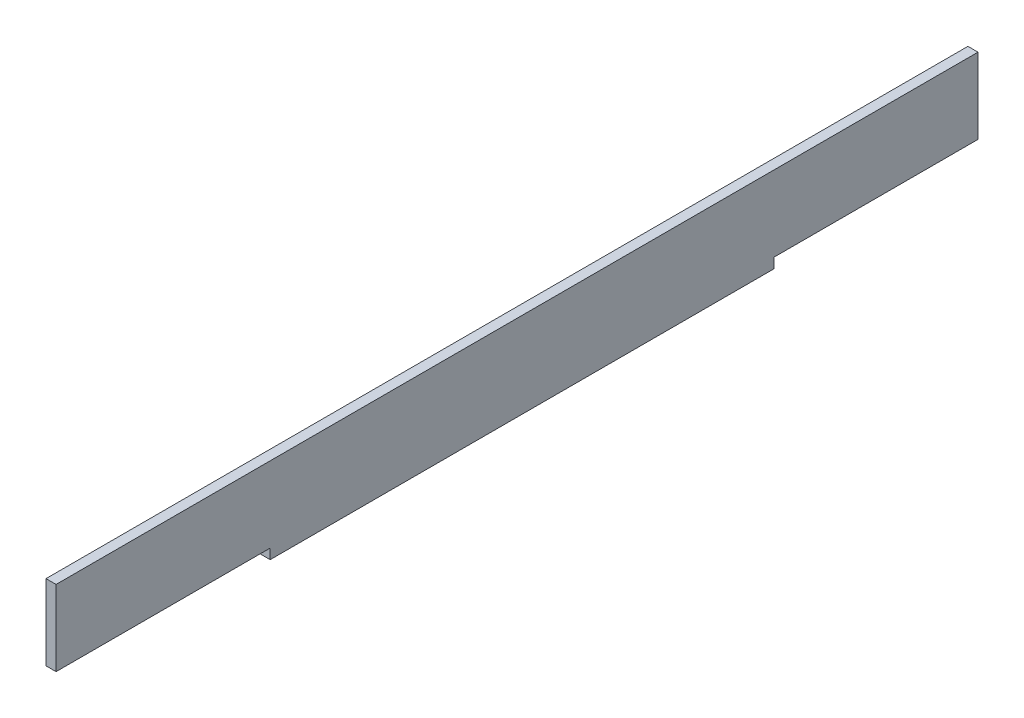
ISO-10303-21;
HEADER;
FILE_DESCRIPTION(('STEP AP214'),'2;1');
FILE_NAME('part.step','',(''),(''),'','','');
FILE_SCHEMA(('AUTOMOTIVE_DESIGN { 1 0 10303 214 1 1 1 1 }'));
ENDSEC;
DATA;
#1=APPLICATION_CONTEXT('core data for automotive mechanical design processes');
#2=APPLICATION_PROTOCOL_DEFINITION('international standard','automotive_design',2000,#1);
#3=PRODUCT_CONTEXT('',#1,'mechanical');
#4=PRODUCT('Part','Part','',(#3));
#5=PRODUCT_RELATED_PRODUCT_CATEGORY('part','',(#4));
#6=PRODUCT_DEFINITION_FORMATION('','',#4);
#7=PRODUCT_DEFINITION_CONTEXT('part definition',#1,'design');
#8=PRODUCT_DEFINITION('design','',#6,#7);
#9=PRODUCT_DEFINITION_SHAPE('','',#8);
#10=(LENGTH_UNIT() NAMED_UNIT(*) SI_UNIT(.MILLI.,.METRE.));
#11=(NAMED_UNIT(*) PLANE_ANGLE_UNIT() SI_UNIT($,.RADIAN.));
#12=(NAMED_UNIT(*) SI_UNIT($,.STERADIAN.) SOLID_ANGLE_UNIT());
#13=UNCERTAINTY_MEASURE_WITH_UNIT(LENGTH_MEASURE(1.E-05),#10,'distance_accuracy_value','');
#14=(GEOMETRIC_REPRESENTATION_CONTEXT(3) GLOBAL_UNCERTAINTY_ASSIGNED_CONTEXT((#13)) GLOBAL_UNIT_ASSIGNED_CONTEXT((#10,
#11,#12)) REPRESENTATION_CONTEXT('',''));
#15=CARTESIAN_POINT('',(0.,0.,0.));
#16=DIRECTION('',(0.,0.,1.));
#17=DIRECTION('',(1.,0.,0.));
#18=AXIS2_PLACEMENT_3D('',#15,#16,#17);
#19=CARTESIAN_POINT('',(4.,-15.0874879098534,103.808662010027));
#20=DIRECTION('',(0.,0.,-1.));
#21=DIRECTION('',(-1.,0.,0.));
#22=AXIS2_PLACEMENT_3D('',#19,#20,#21);
#23=PLANE('',#22);
#24=DIRECTION('',(0.,-1.,0.));
#25=VECTOR('',#24,1.);
#26=CARTESIAN_POINT('',(0.,-15.0874879098534,103.808662010027));
#27=LINE('',#26,#25);
#28=CARTESIAN_POINT('',(0.,-15.0874879098534,103.808662010027));
#29=VERTEX_POINT('',#28);
#30=CARTESIAN_POINT('',(0.,-19.0874879098534,103.808662010027));
#31=VERTEX_POINT('',#30);
#32=EDGE_CURVE('E149',#29,#31,#27,.T.);
#33=ORIENTED_EDGE('',*,*,#32,.T.);
#34=DIRECTION('',(-1.,0.,0.));
#35=VECTOR('',#34,1.);
#36=CARTESIAN_POINT('',(4.,-19.0874879098534,103.808662010027));
#37=LINE('',#36,#35);
#38=CARTESIAN_POINT('',(4.,-19.0874879098534,103.808662010027));
#39=VERTEX_POINT('',#38);
#40=EDGE_CURVE('E11',#39,#31,#37,.T.);
#41=ORIENTED_EDGE('',*,*,#40,.F.);
#42=DIRECTION('',(0.,-1.,0.));
#43=VECTOR('',#42,1.);
#44=CARTESIAN_POINT('',(4.,-15.0874879098534,103.808662010027));
#45=LINE('',#44,#43);
#46=CARTESIAN_POINT('',(4.,-15.0874879098534,103.808662010027));
#47=VERTEX_POINT('',#46);
#48=EDGE_CURVE('E172',#47,#39,#45,.T.);
#49=ORIENTED_EDGE('',*,*,#48,.F.);
#50=DIRECTION('',(-1.,0.,0.));
#51=VECTOR('',#50,1.);
#52=CARTESIAN_POINT('',(4.,-15.0874879098534,103.808662010027));
#53=LINE('',#52,#51);
#54=EDGE_CURVE('E145',#47,#29,#53,.T.);
#55=ORIENTED_EDGE('',*,*,#54,.T.);
#56=EDGE_LOOP('',(#33,#41,#49,#55));
#57=FACE_BOUND('',#56,.T.);
#58=ADVANCED_FACE('F49',(#57),#23,.F.);
#59=CARTESIAN_POINT('',(4.,-19.0874879098534,103.808662010027));
#60=DIRECTION('',(0.,1.,0.));
#61=DIRECTION('',(0.,0.,1.));
#62=AXIS2_PLACEMENT_3D('',#59,#60,#61);
#63=PLANE('',#62);
#64=DIRECTION('',(0.,0.,-1.));
#65=VECTOR('',#64,1.);
#66=CARTESIAN_POINT('',(0.,-19.0874879098534,103.808662010027));
#67=LINE('',#66,#65);
#68=CARTESIAN_POINT('',(0.,-19.0874879098534,-96.1913379899732));
#69=VERTEX_POINT('',#68);
#70=EDGE_CURVE('E153',#31,#69,#67,.T.);
#71=ORIENTED_EDGE('',*,*,#70,.T.);
#72=DIRECTION('',(-1.,0.,0.));
#73=VECTOR('',#72,1.);
#74=CARTESIAN_POINT('',(4.,-19.0874879098534,-96.1913379899732));
#75=LINE('',#74,#73);
#76=CARTESIAN_POINT('',(4.,-19.0874879098534,-96.1913379899732));
#77=VERTEX_POINT('',#76);
#78=EDGE_CURVE('E58',#77,#69,#75,.T.);
#79=ORIENTED_EDGE('',*,*,#78,.F.);
#80=DIRECTION('',(0.,0.,-1.));
#81=VECTOR('',#80,1.);
#82=CARTESIAN_POINT('',(4.,-19.0874879098534,103.808662010027));
#83=LINE('',#82,#81);
#84=EDGE_CURVE('E109',#39,#77,#83,.T.);
#85=ORIENTED_EDGE('',*,*,#84,.F.);
#86=ORIENTED_EDGE('',*,*,#40,.T.);
#87=EDGE_LOOP('',(#71,#79,#85,#86));
#88=FACE_BOUND('',#87,.T.);
#89=ADVANCED_FACE('F218',(#88),#63,.F.);
#90=CARTESIAN_POINT('',(4.,-19.0874879098534,-96.1913379899732));
#91=DIRECTION('',(0.,0.,1.));
#92=DIRECTION('',(1.,0.,0.));
#93=AXIS2_PLACEMENT_3D('',#90,#91,#92);
#94=PLANE('',#93);
#95=DIRECTION('',(0.,1.,0.));
#96=VECTOR('',#95,1.);
#97=CARTESIAN_POINT('',(0.,-19.0874879098534,-96.1913379899732));
#98=LINE('',#97,#96);
#99=CARTESIAN_POINT('',(0.,-15.0874879098534,-96.1913379899732));
#100=VERTEX_POINT('',#99);
#101=EDGE_CURVE('E156',#69,#100,#98,.T.);
#102=ORIENTED_EDGE('',*,*,#101,.T.);
#103=DIRECTION('',(-1.,0.,0.));
#104=VECTOR('',#103,1.);
#105=CARTESIAN_POINT('',(4.,-15.0874879098534,-96.1913379899732));
#106=LINE('',#105,#104);
#107=CARTESIAN_POINT('',(4.,-15.0874879098534,-96.1913379899732));
#108=VERTEX_POINT('',#107);
#109=EDGE_CURVE('E183',#108,#100,#106,.T.);
#110=ORIENTED_EDGE('',*,*,#109,.F.);
#111=DIRECTION('',(0.,1.,0.));
#112=VECTOR('',#111,1.);
#113=CARTESIAN_POINT('',(4.,-19.0874879098534,-96.1913379899732));
#114=LINE('',#113,#112);
#115=EDGE_CURVE('E193',#77,#108,#114,.T.);
#116=ORIENTED_EDGE('',*,*,#115,.F.);
#117=ORIENTED_EDGE('',*,*,#78,.T.);
#118=EDGE_LOOP('',(#102,#110,#116,#117));
#119=FACE_BOUND('',#118,.T.);
#120=ADVANCED_FACE('F191',(#119),#94,.F.);
#121=CARTESIAN_POINT('',(4.,-15.0874879098534,-96.1913379899732));
#122=DIRECTION('',(0.,1.,0.));
#123=DIRECTION('',(0.,0.,1.));
#124=AXIS2_PLACEMENT_3D('',#121,#122,#123);
#125=PLANE('',#124);
#126=DIRECTION('',(0.,0.,-1.));
#127=VECTOR('',#126,1.);
#128=CARTESIAN_POINT('',(0.,-15.0874879098534,-96.1913379899732));
#129=LINE('',#128,#127);
#130=CARTESIAN_POINT('',(0.,-15.0874879098534,-177.191337989973));
#131=VERTEX_POINT('',#130);
#132=EDGE_CURVE('E159',#100,#131,#129,.T.);
#133=ORIENTED_EDGE('',*,*,#132,.T.);
#134=DIRECTION('',(-1.,0.,0.));
#135=VECTOR('',#134,1.);
#136=CARTESIAN_POINT('',(4.,-15.0874879098534,-177.191337989973));
#137=LINE('',#136,#135);
#138=CARTESIAN_POINT('',(4.,-15.0874879098534,-177.191337989973));
#139=VERTEX_POINT('',#138);
#140=EDGE_CURVE('E179',#139,#131,#137,.T.);
#141=ORIENTED_EDGE('',*,*,#140,.F.);
#142=DIRECTION('',(0.,0.,-1.));
#143=VECTOR('',#142,1.);
#144=CARTESIAN_POINT('',(4.,-15.0874879098534,-96.1913379899732));
#145=LINE('',#144,#143);
#146=EDGE_CURVE('E206',#108,#139,#145,.T.);
#147=ORIENTED_EDGE('',*,*,#146,.F.);
#148=ORIENTED_EDGE('',*,*,#109,.T.);
#149=EDGE_LOOP('',(#133,#141,#147,#148));
#150=FACE_BOUND('',#149,.T.);
#151=ADVANCED_FACE('F201',(#150),#125,.F.);
#152=CARTESIAN_POINT('',(4.,-15.0874879098534,-177.191337989973));
#153=DIRECTION('',(0.,0.,1.));
#154=DIRECTION('',(1.,0.,0.));
#155=AXIS2_PLACEMENT_3D('',#152,#153,#154);
#156=PLANE('',#155);
#157=DIRECTION('',(0.,1.,0.));
#158=VECTOR('',#157,1.);
#159=CARTESIAN_POINT('',(0.,-15.0874879098534,-177.191337989973));
#160=LINE('',#159,#158);
#161=CARTESIAN_POINT('',(0.,14.9125120901466,-177.191337989973));
#162=VERTEX_POINT('',#161);
#163=EDGE_CURVE('E162',#131,#162,#160,.T.);
#164=ORIENTED_EDGE('',*,*,#163,.T.);
#165=DIRECTION('',(-1.,0.,0.));
#166=VECTOR('',#165,1.);
#167=CARTESIAN_POINT('',(4.,14.9125120901466,-177.191337989973));
#168=LINE('',#167,#166);
#169=CARTESIAN_POINT('',(4.,14.9125120901466,-177.191337989973));
#170=VERTEX_POINT('',#169);
#171=EDGE_CURVE('E138',#170,#162,#168,.T.);
#172=ORIENTED_EDGE('',*,*,#171,.F.);
#173=DIRECTION('',(0.,1.,0.));
#174=VECTOR('',#173,1.);
#175=CARTESIAN_POINT('',(4.,-15.0874879098534,-177.191337989973));
#176=LINE('',#175,#174);
#177=EDGE_CURVE('E128',#139,#170,#176,.T.);
#178=ORIENTED_EDGE('',*,*,#177,.F.);
#179=ORIENTED_EDGE('',*,*,#140,.T.);
#180=EDGE_LOOP('',(#164,#172,#178,#179));
#181=FACE_BOUND('',#180,.T.);
#182=ADVANCED_FACE('F204',(#181),#156,.F.);
#183=CARTESIAN_POINT('',(4.,14.9125120901466,103.808662010027));
#184=DIRECTION('',(0.,-1.,0.));
#185=DIRECTION('',(0.,0.,-1.));
#186=AXIS2_PLACEMENT_3D('',#183,#184,#185);
#187=PLANE('',#186);
#188=DIRECTION('',(0.,0.,1.));
#189=VECTOR('',#188,1.);
#190=CARTESIAN_POINT('',(0.,14.9125120901466,103.808662010027));
#191=LINE('',#190,#189);
#192=CARTESIAN_POINT('',(0.,14.9125120901466,188.808662010027));
#193=VERTEX_POINT('',#192);
#194=EDGE_CURVE('E136',#162,#193,#191,.T.);
#195=ORIENTED_EDGE('',*,*,#194,.T.);
#196=DIRECTION('',(-1.,0.,0.));
#197=VECTOR('',#196,1.);
#198=CARTESIAN_POINT('',(4.,14.9125120901466,188.808662010027));
#199=LINE('',#198,#197);
#200=CARTESIAN_POINT('',(4.,14.9125120901466,188.808662010027));
#201=VERTEX_POINT('',#200);
#202=EDGE_CURVE('E134',#201,#193,#199,.T.);
#203=ORIENTED_EDGE('',*,*,#202,.F.);
#204=DIRECTION('',(0.,0.,1.));
#205=VECTOR('',#204,1.);
#206=CARTESIAN_POINT('',(4.,14.9125120901466,-177.191337989973));
#207=LINE('',#206,#205);
#208=EDGE_CURVE('E122',#170,#201,#207,.T.);
#209=ORIENTED_EDGE('',*,*,#208,.F.);
#210=ORIENTED_EDGE('',*,*,#171,.T.);
#211=EDGE_LOOP('',(#195,#203,#209,#210));
#212=FACE_BOUND('',#211,.T.);
#213=ADVANCED_FACE('F135',(#212),#187,.F.);
#214=CARTESIAN_POINT('',(4.,14.9125120901466,188.808662010027));
#215=DIRECTION('',(0.,0.,-1.));
#216=DIRECTION('',(-1.,0.,0.));
#217=AXIS2_PLACEMENT_3D('',#214,#215,#216);
#218=PLANE('',#217);
#219=DIRECTION('',(0.,-1.,0.));
#220=VECTOR('',#219,1.);
#221=CARTESIAN_POINT('',(0.,14.9125120901466,188.808662010027));
#222=LINE('',#221,#220);
#223=CARTESIAN_POINT('',(0.,-15.0874879098534,188.808662010027));
#224=VERTEX_POINT('',#223);
#225=EDGE_CURVE('E95',#193,#224,#222,.T.);
#226=ORIENTED_EDGE('',*,*,#225,.T.);
#227=DIRECTION('',(-1.,0.,0.));
#228=VECTOR('',#227,1.);
#229=CARTESIAN_POINT('',(4.,-15.0874879098534,188.808662010027));
#230=LINE('',#229,#228);
#231=CARTESIAN_POINT('',(4.,-15.0874879098534,188.808662010027));
#232=VERTEX_POINT('',#231);
#233=EDGE_CURVE('E139',#232,#224,#230,.T.);
#234=ORIENTED_EDGE('',*,*,#233,.F.);
#235=DIRECTION('',(0.,-1.,0.));
#236=VECTOR('',#235,1.);
#237=CARTESIAN_POINT('',(4.,14.9125120901466,188.808662010027));
#238=LINE('',#237,#236);
#239=EDGE_CURVE('E126',#201,#232,#238,.T.);
#240=ORIENTED_EDGE('',*,*,#239,.F.);
#241=ORIENTED_EDGE('',*,*,#202,.T.);
#242=EDGE_LOOP('',(#226,#234,#240,#241));
#243=FACE_BOUND('',#242,.T.);
#244=ADVANCED_FACE('F141',(#243),#218,.F.);
#245=CARTESIAN_POINT('',(4.,-15.0874879098534,188.808662010027));
#246=DIRECTION('',(0.,1.,0.));
#247=DIRECTION('',(0.,0.,1.));
#248=AXIS2_PLACEMENT_3D('',#245,#246,#247);
#249=PLANE('',#248);
#250=DIRECTION('',(0.,0.,-1.));
#251=VECTOR('',#250,1.);
#252=CARTESIAN_POINT('',(0.,-15.0874879098534,188.808662010027));
#253=LINE('',#252,#251);
#254=EDGE_CURVE('E101',#224,#29,#253,.T.);
#255=ORIENTED_EDGE('',*,*,#254,.T.);
#256=ORIENTED_EDGE('',*,*,#54,.F.);
#257=DIRECTION('',(0.,0.,-1.));
#258=VECTOR('',#257,1.);
#259=CARTESIAN_POINT('',(4.,-15.0874879098534,188.808662010027));
#260=LINE('',#259,#258);
#261=EDGE_CURVE('E66',#232,#47,#260,.T.);
#262=ORIENTED_EDGE('',*,*,#261,.F.);
#263=ORIENTED_EDGE('',*,*,#233,.T.);
#264=EDGE_LOOP('',(#255,#256,#262,#263));
#265=FACE_BOUND('',#264,.T.);
#266=ADVANCED_FACE('F234',(#265),#249,.F.);
#267=CARTESIAN_POINT('',(4.,0.,0.));
#268=DIRECTION('',(1.,0.,0.));
#269=DIRECTION('',(0.,0.,-1.));
#270=AXIS2_PLACEMENT_3D('',#267,#268,#269);
#271=PLANE('',#270);
#272=ORIENTED_EDGE('',*,*,#48,.T.);
#273=ORIENTED_EDGE('',*,*,#84,.T.);
#274=ORIENTED_EDGE('',*,*,#115,.T.);
#275=ORIENTED_EDGE('',*,*,#146,.T.);
#276=ORIENTED_EDGE('',*,*,#177,.T.);
#277=ORIENTED_EDGE('',*,*,#208,.T.);
#278=ORIENTED_EDGE('',*,*,#239,.T.);
#279=ORIENTED_EDGE('',*,*,#261,.T.);
#280=EDGE_LOOP('',(#272,#273,#274,#275,#276,#277,#278,#279));
#281=FACE_BOUND('',#280,.T.);
#282=ADVANCED_FACE('F124',(#281),#271,.T.);
#283=CARTESIAN_POINT('',(0.,0.,0.));
#284=DIRECTION('',(1.,0.,0.));
#285=DIRECTION('',(0.,0.,-1.));
#286=AXIS2_PLACEMENT_3D('',#283,#284,#285);
#287=PLANE('',#286);
#288=ORIENTED_EDGE('',*,*,#32,.F.);
#289=ORIENTED_EDGE('',*,*,#254,.F.);
#290=ORIENTED_EDGE('',*,*,#225,.F.);
#291=ORIENTED_EDGE('',*,*,#194,.F.);
#292=ORIENTED_EDGE('',*,*,#163,.F.);
#293=ORIENTED_EDGE('',*,*,#132,.F.);
#294=ORIENTED_EDGE('',*,*,#101,.F.);
#295=ORIENTED_EDGE('',*,*,#70,.F.);
#296=EDGE_LOOP('',(#288,#289,#290,#291,#292,#293,#294,#295));
#297=FACE_BOUND('',#296,.T.);
#298=ADVANCED_FACE('F197',(#297),#287,.F.);
#299=CLOSED_SHELL('',(#58,#89,#120,#151,#182,#213,#244,#266,#282,#298));
#300=MANIFOLD_SOLID_BREP('B2',#299);
#301=ADVANCED_BREP_SHAPE_REPRESENTATION('',(#18,#300),#14);
#302=SHAPE_DEFINITION_REPRESENTATION(#9,#301);
ENDSEC;
END-ISO-10303-21;
